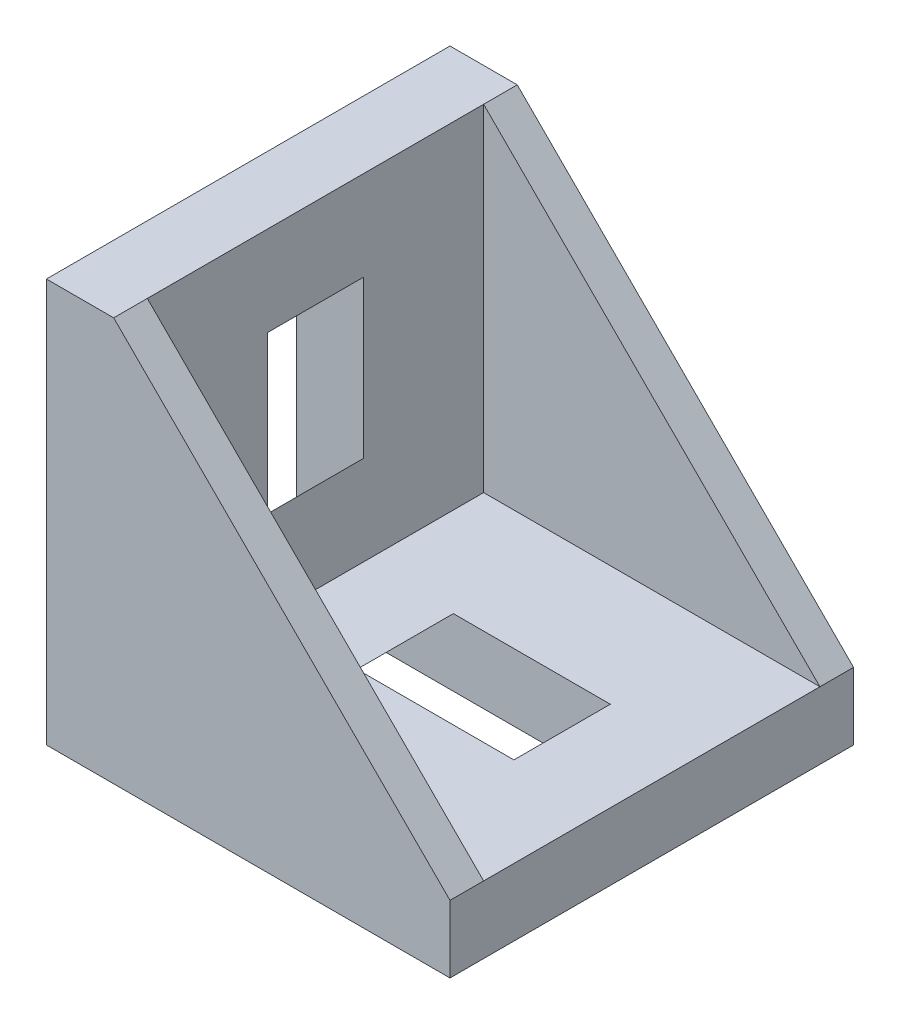
ISO-10303-21;
HEADER;
FILE_DESCRIPTION(('STEP AP214'),'2;1');
FILE_NAME('part.step','',(''),(''),'','','');
FILE_SCHEMA(('AUTOMOTIVE_DESIGN { 1 0 10303 214 1 1 1 1 }'));
ENDSEC;
DATA;
#1=APPLICATION_CONTEXT('core data for automotive mechanical design processes');
#2=APPLICATION_PROTOCOL_DEFINITION('international standard','automotive_design',2000,#1);
#3=PRODUCT_CONTEXT('',#1,'mechanical');
#4=PRODUCT('Part','Part','',(#3));
#5=PRODUCT_RELATED_PRODUCT_CATEGORY('part','',(#4));
#6=PRODUCT_DEFINITION_FORMATION('','',#4);
#7=PRODUCT_DEFINITION_CONTEXT('part definition',#1,'design');
#8=PRODUCT_DEFINITION('design','',#6,#7);
#9=PRODUCT_DEFINITION_SHAPE('','',#8);
#10=(LENGTH_UNIT() NAMED_UNIT(*) SI_UNIT(.MILLI.,.METRE.));
#11=(NAMED_UNIT(*) PLANE_ANGLE_UNIT() SI_UNIT($,.RADIAN.));
#12=(NAMED_UNIT(*) SI_UNIT($,.STERADIAN.) SOLID_ANGLE_UNIT());
#13=UNCERTAINTY_MEASURE_WITH_UNIT(LENGTH_MEASURE(1.E-05),#10,'distance_accuracy_value','');
#14=(GEOMETRIC_REPRESENTATION_CONTEXT(3) GLOBAL_UNCERTAINTY_ASSIGNED_CONTEXT((#13)) GLOBAL_UNIT_ASSIGNED_CONTEXT((#10,
#11,#12)) REPRESENTATION_CONTEXT('',''));
#15=CARTESIAN_POINT('',(0.,0.,0.));
#16=DIRECTION('',(0.,0.,1.));
#17=DIRECTION('',(1.,0.,0.));
#18=AXIS2_PLACEMENT_3D('',#15,#16,#17);
#19=CARTESIAN_POINT('',(0.,0.,9.));
#20=DIRECTION('',(1.,0.,0.));
#21=DIRECTION('',(0.,0.,-1.));
#22=AXIS2_PLACEMENT_3D('',#19,#20,#21);
#23=PLANE('',#22);
#24=DIRECTION('',(0.,0.,-1.));
#25=VECTOR('',#24,1.);
#26=CARTESIAN_POINT('',(0.,17.3,2.5));
#27=LINE('',#26,#25);
#28=CARTESIAN_POINT('',(0.,17.3,2.5));
#29=VERTEX_POINT('',#28);
#30=CARTESIAN_POINT('',(0.,17.3,-2.5));
#31=VERTEX_POINT('',#30);
#32=EDGE_CURVE('E52',#29,#31,#27,.T.);
#33=ORIENTED_EDGE('',*,*,#32,.F.);
#34=DIRECTION('',(0.,1.,0.));
#35=VECTOR('',#34,1.);
#36=CARTESIAN_POINT('',(0.,17.3,2.5));
#37=LINE('',#36,#35);
#38=CARTESIAN_POINT('',(0.,14.9992165715514,2.5));
#39=VERTEX_POINT('',#38);
#40=EDGE_CURVE('E56',#39,#29,#37,.T.);
#41=ORIENTED_EDGE('',*,*,#40,.F.);
#42=DIRECTION('',(0.,0.,-1.));
#43=VECTOR('',#42,1.);
#44=CARTESIAN_POINT('',(0.,14.9992165715514,2.5));
#45=LINE('',#44,#43);
#46=CARTESIAN_POINT('',(0.,14.9992165715514,-2.5));
#47=VERTEX_POINT('',#46);
#48=EDGE_CURVE('E222',#39,#47,#45,.T.);
#49=ORIENTED_EDGE('',*,*,#48,.T.);
#50=DIRECTION('',(0.,1.,0.));
#51=VECTOR('',#50,1.);
#52=CARTESIAN_POINT('',(0.,17.3,-2.5));
#53=LINE('',#52,#51);
#54=EDGE_CURVE('E212',#47,#31,#53,.T.);
#55=ORIENTED_EDGE('',*,*,#54,.T.);
#56=EDGE_LOOP('',(#33,#41,#49,#55));
#57=FACE_BOUND('',#56,.T.);
#58=DIRECTION('',(0.,-1.,0.));
#59=VECTOR('',#58,1.);
#60=CARTESIAN_POINT('',(0.,14.,-2.15));
#61=LINE('',#60,#59);
#62=CARTESIAN_POINT('',(0.,14.,-2.15));
#63=VERTEX_POINT('',#62);
#64=CARTESIAN_POINT('',(0.,4.,-2.15));
#65=VERTEX_POINT('',#64);
#66=EDGE_CURVE('E285',#63,#65,#61,.T.);
#67=ORIENTED_EDGE('',*,*,#66,.F.);
#68=DIRECTION('',(0.,0.,1.));
#69=VECTOR('',#68,1.);
#70=CARTESIAN_POINT('',(0.,14.,-2.15));
#71=LINE('',#70,#69);
#72=CARTESIAN_POINT('',(0.,14.,2.15));
#73=VERTEX_POINT('',#72);
#74=EDGE_CURVE('E308',#63,#73,#71,.T.);
#75=ORIENTED_EDGE('',*,*,#74,.T.);
#76=DIRECTION('',(0.,-1.,0.));
#77=VECTOR('',#76,1.);
#78=CARTESIAN_POINT('',(0.,14.,2.15));
#79=LINE('',#78,#77);
#80=CARTESIAN_POINT('',(0.,4.,2.15));
#81=VERTEX_POINT('',#80);
#82=EDGE_CURVE('E276',#73,#81,#79,.T.);
#83=ORIENTED_EDGE('',*,*,#82,.T.);
#84=DIRECTION('',(0.,0.,1.));
#85=VECTOR('',#84,1.);
#86=CARTESIAN_POINT('',(0.,4.,-2.15));
#87=LINE('',#86,#85);
#88=EDGE_CURVE('E297',#65,#81,#87,.T.);
#89=ORIENTED_EDGE('',*,*,#88,.F.);
#90=EDGE_LOOP('',(#67,#75,#83,#89));
#91=FACE_BOUND('',#90,.T.);
#92=DIRECTION('',(0.,-1.,0.));
#93=VECTOR('',#92,1.);
#94=CARTESIAN_POINT('',(0.,0.,-9.));
#95=LINE('',#94,#93);
#96=CARTESIAN_POINT('',(0.,18.,-9.));
#97=VERTEX_POINT('',#96);
#98=CARTESIAN_POINT('',(0.,0.,-9.));
#99=VERTEX_POINT('',#98);
#100=EDGE_CURVE('E348',#97,#99,#95,.T.);
#101=ORIENTED_EDGE('',*,*,#100,.T.);
#102=DIRECTION('',(0.,0.,-1.));
#103=VECTOR('',#102,1.);
#104=CARTESIAN_POINT('',(0.,0.,9.));
#105=LINE('',#104,#103);
#106=CARTESIAN_POINT('',(0.,0.,9.));
#107=VERTEX_POINT('',#106);
#108=EDGE_CURVE('E356',#107,#99,#105,.T.);
#109=ORIENTED_EDGE('',*,*,#108,.F.);
#110=DIRECTION('',(0.,-1.,0.));
#111=VECTOR('',#110,1.);
#112=CARTESIAN_POINT('',(0.,0.,9.));
#113=LINE('',#112,#111);
#114=CARTESIAN_POINT('',(0.,18.,9.));
#115=VERTEX_POINT('',#114);
#116=EDGE_CURVE('E354',#115,#107,#113,.T.);
#117=ORIENTED_EDGE('',*,*,#116,.F.);
#118=DIRECTION('',(0.,0.,-1.));
#119=VECTOR('',#118,1.);
#120=CARTESIAN_POINT('',(0.,18.,9.));
#121=LINE('',#120,#119);
#122=EDGE_CURVE('E370',#115,#97,#121,.T.);
#123=ORIENTED_EDGE('',*,*,#122,.T.);
#124=EDGE_LOOP('',(#101,#109,#117,#123));
#125=FACE_BOUND('',#124,.T.);
#126=DIRECTION('',(0.,1.,0.));
#127=VECTOR('',#126,1.);
#128=CARTESIAN_POINT('',(0.,1.23475047748417,2.5));
#129=LINE('',#128,#127);
#130=CARTESIAN_POINT('',(0.,1.23475047748417,2.5));
#131=VERTEX_POINT('',#130);
#132=CARTESIAN_POINT('',(0.,3.53553390593273,2.5));
#133=VERTEX_POINT('',#132);
#134=EDGE_CURVE('E226',#131,#133,#129,.T.);
#135=ORIENTED_EDGE('',*,*,#134,.F.);
#136=DIRECTION('',(0.,0.,-1.));
#137=VECTOR('',#136,1.);
#138=CARTESIAN_POINT('',(0.,1.23475047748417,2.5));
#139=LINE('',#138,#137);
#140=CARTESIAN_POINT('',(0.,1.23475047748417,-2.5));
#141=VERTEX_POINT('',#140);
#142=EDGE_CURVE('E235',#131,#141,#139,.T.);
#143=ORIENTED_EDGE('',*,*,#142,.T.);
#144=DIRECTION('',(0.,1.,0.));
#145=VECTOR('',#144,1.);
#146=CARTESIAN_POINT('',(0.,1.23475047748417,-2.5));
#147=LINE('',#146,#145);
#148=CARTESIAN_POINT('',(0.,3.53553390593273,-2.5));
#149=VERTEX_POINT('',#148);
#150=EDGE_CURVE('E217',#141,#149,#147,.T.);
#151=ORIENTED_EDGE('',*,*,#150,.T.);
#152=DIRECTION('',(0.,0.,-1.));
#153=VECTOR('',#152,1.);
#154=CARTESIAN_POINT('',(0.,3.53553390593273,2.5));
#155=LINE('',#154,#153);
#156=EDGE_CURVE('E249',#133,#149,#155,.T.);
#157=ORIENTED_EDGE('',*,*,#156,.F.);
#158=EDGE_LOOP('',(#135,#143,#151,#157));
#159=FACE_BOUND('',#158,.T.);
#160=ADVANCED_FACE('F37',(#57,#91,#125,#159),#23,.F.);
#161=CARTESIAN_POINT('',(18.,0.,9.));
#162=DIRECTION('',(0.,1.,0.));
#163=DIRECTION('',(-1.,0.,0.));
#164=AXIS2_PLACEMENT_3D('',#161,#162,#163);
#165=PLANE('',#164);
#166=DIRECTION('',(1.,0.,0.));
#167=VECTOR('',#166,1.);
#168=CARTESIAN_POINT('',(4.,0.,-2.15));
#169=LINE('',#168,#167);
#170=CARTESIAN_POINT('',(4.,0.,-2.15));
#171=VERTEX_POINT('',#170);
#172=CARTESIAN_POINT('',(14.,0.,-2.15));
#173=VERTEX_POINT('',#172);
#174=EDGE_CURVE('E255',#171,#173,#169,.T.);
#175=ORIENTED_EDGE('',*,*,#174,.F.);
#176=DIRECTION('',(0.,0.,1.));
#177=VECTOR('',#176,1.);
#178=CARTESIAN_POINT('',(4.,0.,-2.15));
#179=LINE('',#178,#177);
#180=CARTESIAN_POINT('',(4.,0.,2.15));
#181=VERTEX_POINT('',#180);
#182=EDGE_CURVE('E264',#171,#181,#179,.T.);
#183=ORIENTED_EDGE('',*,*,#182,.T.);
#184=DIRECTION('',(1.,0.,0.));
#185=VECTOR('',#184,1.);
#186=CARTESIAN_POINT('',(4.,0.,2.15));
#187=LINE('',#186,#185);
#188=CARTESIAN_POINT('',(14.,0.,2.15));
#189=VERTEX_POINT('',#188);
#190=EDGE_CURVE('E267',#181,#189,#187,.T.);
#191=ORIENTED_EDGE('',*,*,#190,.T.);
#192=DIRECTION('',(0.,0.,1.));
#193=VECTOR('',#192,1.);
#194=CARTESIAN_POINT('',(14.,0.,-2.15));
#195=LINE('',#194,#193);
#196=EDGE_CURVE('E280',#173,#189,#195,.T.);
#197=ORIENTED_EDGE('',*,*,#196,.F.);
#198=EDGE_LOOP('',(#175,#183,#191,#197));
#199=FACE_BOUND('',#198,.T.);
#200=DIRECTION('',(1.,0.,0.));
#201=VECTOR('',#200,1.);
#202=CARTESIAN_POINT('',(18.,0.,-9.));
#203=LINE('',#202,#201);
#204=CARTESIAN_POINT('',(18.,0.,-9.));
#205=VERTEX_POINT('',#204);
#206=EDGE_CURVE('E340',#99,#205,#203,.T.);
#207=ORIENTED_EDGE('',*,*,#206,.T.);
#208=DIRECTION('',(0.,0.,-1.));
#209=VECTOR('',#208,1.);
#210=CARTESIAN_POINT('',(18.,0.,9.));
#211=LINE('',#210,#209);
#212=CARTESIAN_POINT('',(18.,0.,9.));
#213=VERTEX_POINT('',#212);
#214=EDGE_CURVE('E11',#213,#205,#211,.T.);
#215=ORIENTED_EDGE('',*,*,#214,.F.);
#216=DIRECTION('',(1.,0.,0.));
#217=VECTOR('',#216,1.);
#218=CARTESIAN_POINT('',(18.,0.,9.));
#219=LINE('',#218,#217);
#220=EDGE_CURVE('E344',#107,#213,#219,.T.);
#221=ORIENTED_EDGE('',*,*,#220,.F.);
#222=ORIENTED_EDGE('',*,*,#108,.T.);
#223=EDGE_LOOP('',(#207,#215,#221,#222));
#224=FACE_BOUND('',#223,.T.);
#225=ADVANCED_FACE('F39',(#199,#224),#165,.F.);
#226=CARTESIAN_POINT('',(3.,3.,-7.5));
#227=DIRECTION('',(0.,-1.,0.));
#228=DIRECTION('',(0.,0.,-1.));
#229=AXIS2_PLACEMENT_3D('',#226,#227,#228);
#230=PLANE('',#229);
#231=DIRECTION('',(1.,0.,0.));
#232=VECTOR('',#231,1.);
#233=CARTESIAN_POINT('',(3.,3.,7.5));
#234=LINE('',#233,#232);
#235=CARTESIAN_POINT('',(3.,3.,7.5));
#236=VERTEX_POINT('',#235);
#237=CARTESIAN_POINT('',(18.,3.,7.5));
#238=VERTEX_POINT('',#237);
#239=EDGE_CURVE('E323',#236,#238,#234,.T.);
#240=ORIENTED_EDGE('',*,*,#239,.T.);
#241=DIRECTION('',(0.,0.,1.));
#242=VECTOR('',#241,1.);
#243=CARTESIAN_POINT('',(18.,3.,-7.5));
#244=LINE('',#243,#242);
#245=CARTESIAN_POINT('',(18.,3.,-7.5));
#246=VERTEX_POINT('',#245);
#247=EDGE_CURVE('E337',#246,#238,#244,.T.);
#248=ORIENTED_EDGE('',*,*,#247,.F.);
#249=DIRECTION('',(1.,0.,0.));
#250=VECTOR('',#249,1.);
#251=CARTESIAN_POINT('',(3.,3.,-7.5));
#252=LINE('',#251,#250);
#253=CARTESIAN_POINT('',(3.,3.,-7.5));
#254=VERTEX_POINT('',#253);
#255=EDGE_CURVE('E326',#254,#246,#252,.T.);
#256=ORIENTED_EDGE('',*,*,#255,.F.);
#257=DIRECTION('',(0.,0.,1.));
#258=VECTOR('',#257,1.);
#259=CARTESIAN_POINT('',(3.,3.,-7.5));
#260=LINE('',#259,#258);
#261=EDGE_CURVE('E341',#254,#236,#260,.T.);
#262=ORIENTED_EDGE('',*,*,#261,.T.);
#263=EDGE_LOOP('',(#240,#248,#256,#262));
#264=FACE_BOUND('',#263,.T.);
#265=DIRECTION('',(-1.,0.,0.));
#266=VECTOR('',#265,1.);
#267=CARTESIAN_POINT('',(7.,3.,-2.15));
#268=LINE('',#267,#266);
#269=CARTESIAN_POINT('',(14.,3.,-2.15));
#270=VERTEX_POINT('',#269);
#271=CARTESIAN_POINT('',(7.,3.,-2.15));
#272=VERTEX_POINT('',#271);
#273=EDGE_CURVE('E261',#270,#272,#268,.T.);
#274=ORIENTED_EDGE('',*,*,#273,.F.);
#275=DIRECTION('',(0.,0.,1.));
#276=VECTOR('',#275,1.);
#277=CARTESIAN_POINT('',(14.,3.,-2.15));
#278=LINE('',#277,#276);
#279=CARTESIAN_POINT('',(14.,3.,2.15));
#280=VERTEX_POINT('',#279);
#281=EDGE_CURVE('E277',#270,#280,#278,.T.);
#282=ORIENTED_EDGE('',*,*,#281,.T.);
#283=DIRECTION('',(-1.,0.,0.));
#284=VECTOR('',#283,1.);
#285=CARTESIAN_POINT('',(7.,3.,2.15));
#286=LINE('',#285,#284);
#287=CARTESIAN_POINT('',(7.,3.,2.15));
#288=VERTEX_POINT('',#287);
#289=EDGE_CURVE('E256',#280,#288,#286,.T.);
#290=ORIENTED_EDGE('',*,*,#289,.T.);
#291=DIRECTION('',(0.,0.,1.));
#292=VECTOR('',#291,1.);
#293=CARTESIAN_POINT('',(7.,3.,-2.15));
#294=LINE('',#293,#292);
#295=EDGE_CURVE('E273',#272,#288,#294,.T.);
#296=ORIENTED_EDGE('',*,*,#295,.F.);
#297=EDGE_LOOP('',(#274,#282,#290,#296));
#298=FACE_BOUND('',#297,.T.);
#299=ADVANCED_FACE('F414',(#264,#298),#230,.F.);
#300=CARTESIAN_POINT('',(3.,18.,-7.5));
#301=DIRECTION('',(-1.,0.,0.));
#302=DIRECTION('',(0.,-1.,0.));
#303=AXIS2_PLACEMENT_3D('',#300,#301,#302);
#304=PLANE('',#303);
#305=DIRECTION('',(0.,-1.,0.));
#306=VECTOR('',#305,1.);
#307=CARTESIAN_POINT('',(3.,18.,7.5));
#308=LINE('',#307,#306);
#309=CARTESIAN_POINT('',(3.,18.,7.5));
#310=VERTEX_POINT('',#309);
#311=EDGE_CURVE('E332',#310,#236,#308,.T.);
#312=ORIENTED_EDGE('',*,*,#311,.T.);
#313=ORIENTED_EDGE('',*,*,#261,.F.);
#314=DIRECTION('',(0.,-1.,0.));
#315=VECTOR('',#314,1.);
#316=CARTESIAN_POINT('',(3.,18.,-7.5));
#317=LINE('',#316,#315);
#318=CARTESIAN_POINT('',(3.,18.,-7.5));
#319=VERTEX_POINT('',#318);
#320=EDGE_CURVE('E322',#319,#254,#317,.T.);
#321=ORIENTED_EDGE('',*,*,#320,.F.);
#322=DIRECTION('',(0.,0.,1.));
#323=VECTOR('',#322,1.);
#324=CARTESIAN_POINT('',(3.,18.,-7.5));
#325=LINE('',#324,#323);
#326=EDGE_CURVE('E329',#319,#310,#325,.T.);
#327=ORIENTED_EDGE('',*,*,#326,.T.);
#328=EDGE_LOOP('',(#312,#313,#321,#327));
#329=FACE_BOUND('',#328,.T.);
#330=DIRECTION('',(0.,1.,0.));
#331=VECTOR('',#330,1.);
#332=CARTESIAN_POINT('',(3.,14.,-2.15));
#333=LINE('',#332,#331);
#334=CARTESIAN_POINT('',(3.,7.,-2.15));
#335=VERTEX_POINT('',#334);
#336=CARTESIAN_POINT('',(3.,14.,-2.15));
#337=VERTEX_POINT('',#336);
#338=EDGE_CURVE('E292',#335,#337,#333,.T.);
#339=ORIENTED_EDGE('',*,*,#338,.F.);
#340=DIRECTION('',(0.,0.,1.));
#341=VECTOR('',#340,1.);
#342=CARTESIAN_POINT('',(3.,7.,-2.15));
#343=LINE('',#342,#341);
#344=CARTESIAN_POINT('',(3.,7.,2.15));
#345=VERTEX_POINT('',#344);
#346=EDGE_CURVE('E315',#335,#345,#343,.T.);
#347=ORIENTED_EDGE('',*,*,#346,.T.);
#348=DIRECTION('',(0.,1.,0.));
#349=VECTOR('',#348,1.);
#350=CARTESIAN_POINT('',(3.,14.,2.15));
#351=LINE('',#350,#349);
#352=CARTESIAN_POINT('',(3.,14.,2.15));
#353=VERTEX_POINT('',#352);
#354=EDGE_CURVE('E303',#345,#353,#351,.T.);
#355=ORIENTED_EDGE('',*,*,#354,.T.);
#356=DIRECTION('',(0.,0.,1.));
#357=VECTOR('',#356,1.);
#358=CARTESIAN_POINT('',(3.,14.,-2.15));
#359=LINE('',#358,#357);
#360=EDGE_CURVE('E312',#337,#353,#359,.T.);
#361=ORIENTED_EDGE('',*,*,#360,.F.);
#362=EDGE_LOOP('',(#339,#347,#355,#361));
#363=FACE_BOUND('',#362,.T.);
#364=ADVANCED_FACE('F419',(#329,#363),#304,.F.);
#365=CARTESIAN_POINT('',(18.,3.,9.));
#366=DIRECTION('',(-0.707106781186547,-0.707106781186547,0.));
#367=DIRECTION('',(0.707106781186548,-0.707106781186548,0.));
#368=AXIS2_PLACEMENT_3D('',#365,#366,#367);
#369=PLANE('',#368);
#370=DIRECTION('',(-0.707106781186547,0.707106781186547,0.));
#371=VECTOR('',#370,1.);
#372=CARTESIAN_POINT('',(3.,18.,-7.5));
#373=LINE('',#372,#371);
#374=EDGE_CURVE('E320',#246,#319,#373,.T.);
#375=ORIENTED_EDGE('',*,*,#374,.F.);
#376=DIRECTION('',(0.,0.,-1.));
#377=VECTOR('',#376,1.);
#378=CARTESIAN_POINT('',(18.,3.,9.));
#379=LINE('',#378,#377);
#380=CARTESIAN_POINT('',(18.,3.,-9.));
#381=VERTEX_POINT('',#380);
#382=EDGE_CURVE('E376',#246,#381,#379,.T.);
#383=ORIENTED_EDGE('',*,*,#382,.T.);
#384=DIRECTION('',(-0.707106781186547,0.707106781186547,0.));
#385=VECTOR('',#384,1.);
#386=CARTESIAN_POINT('',(18.,3.,-9.));
#387=LINE('',#386,#385);
#388=CARTESIAN_POINT('',(3.,18.,-9.));
#389=VERTEX_POINT('',#388);
#390=EDGE_CURVE('E362',#381,#389,#387,.T.);
#391=ORIENTED_EDGE('',*,*,#390,.T.);
#392=DIRECTION('',(0.,0.,-1.));
#393=VECTOR('',#392,1.);
#394=CARTESIAN_POINT('',(3.,18.,9.));
#395=LINE('',#394,#393);
#396=EDGE_CURVE('E373',#319,#389,#395,.T.);
#397=ORIENTED_EDGE('',*,*,#396,.F.);
#398=EDGE_LOOP('',(#375,#383,#391,#397));
#399=FACE_BOUND('',#398,.T.);
#400=ADVANCED_FACE('F384',(#399),#369,.F.);
#401=CARTESIAN_POINT('',(18.,3.,9.));
#402=DIRECTION('',(-1.,0.,0.));
#403=DIRECTION('',(0.,0.,1.));
#404=AXIS2_PLACEMENT_3D('',#401,#402,#403);
#405=PLANE('',#404);
#406=DIRECTION('',(0.,1.,0.));
#407=VECTOR('',#406,1.);
#408=CARTESIAN_POINT('',(18.,3.,-9.));
#409=LINE('',#408,#407);
#410=EDGE_CURVE('E359',#205,#381,#409,.T.);
#411=ORIENTED_EDGE('',*,*,#410,.T.);
#412=ORIENTED_EDGE('',*,*,#382,.F.);
#413=ORIENTED_EDGE('',*,*,#247,.T.);
#414=CARTESIAN_POINT('',(18.,3.,9.));
#415=VERTEX_POINT('',#414);
#416=EDGE_CURVE('E45',#415,#238,#379,.T.);
#417=ORIENTED_EDGE('',*,*,#416,.F.);
#418=DIRECTION('',(0.,1.,0.));
#419=VECTOR('',#418,1.);
#420=CARTESIAN_POINT('',(18.,3.,9.));
#421=LINE('',#420,#419);
#422=EDGE_CURVE('E347',#213,#415,#421,.T.);
#423=ORIENTED_EDGE('',*,*,#422,.F.);
#424=ORIENTED_EDGE('',*,*,#214,.T.);
#425=EDGE_LOOP('',(#411,#412,#413,#417,#423,#424));
#426=FACE_BOUND('',#425,.T.);
#427=ADVANCED_FACE('F389',(#426),#405,.F.);
#428=ORIENTED_EDGE('',*,*,#416,.T.);
#429=DIRECTION('',(-0.707106781186547,0.707106781186547,0.));
#430=VECTOR('',#429,1.);
#431=CARTESIAN_POINT('',(3.,18.,7.5));
#432=LINE('',#431,#430);
#433=EDGE_CURVE('E311',#238,#310,#432,.T.);
#434=ORIENTED_EDGE('',*,*,#433,.T.);
#435=CARTESIAN_POINT('',(3.,18.,9.));
#436=VERTEX_POINT('',#435);
#437=EDGE_CURVE('E374',#436,#310,#395,.T.);
#438=ORIENTED_EDGE('',*,*,#437,.F.);
#439=DIRECTION('',(-0.707106781186547,0.707106781186547,0.));
#440=VECTOR('',#439,1.);
#441=CARTESIAN_POINT('',(18.,3.,9.));
#442=LINE('',#441,#440);
#443=EDGE_CURVE('E350',#415,#436,#442,.T.);
#444=ORIENTED_EDGE('',*,*,#443,.F.);
#445=EDGE_LOOP('',(#428,#434,#438,#444));
#446=FACE_BOUND('',#445,.T.);
#447=ADVANCED_FACE('F408',(#446),#369,.F.);
#448=CARTESIAN_POINT('',(3.,18.,9.));
#449=DIRECTION('',(0.,-1.,0.));
#450=DIRECTION('',(0.,0.,-1.));
#451=AXIS2_PLACEMENT_3D('',#448,#449,#450);
#452=PLANE('',#451);
#453=DIRECTION('',(-1.,0.,0.));
#454=VECTOR('',#453,1.);
#455=CARTESIAN_POINT('',(3.,18.,-9.));
#456=LINE('',#455,#454);
#457=EDGE_CURVE('E365',#389,#97,#456,.T.);
#458=ORIENTED_EDGE('',*,*,#457,.T.);
#459=ORIENTED_EDGE('',*,*,#122,.F.);
#460=DIRECTION('',(-1.,0.,0.));
#461=VECTOR('',#460,1.);
#462=CARTESIAN_POINT('',(3.,18.,9.));
#463=LINE('',#462,#461);
#464=EDGE_CURVE('E352',#436,#115,#463,.T.);
#465=ORIENTED_EDGE('',*,*,#464,.F.);
#466=ORIENTED_EDGE('',*,*,#437,.T.);
#467=ORIENTED_EDGE('',*,*,#326,.F.);
#468=ORIENTED_EDGE('',*,*,#396,.T.);
#469=EDGE_LOOP('',(#458,#459,#465,#466,#467,#468));
#470=FACE_BOUND('',#469,.T.);
#471=ADVANCED_FACE('F397',(#470),#452,.F.);
#472=CARTESIAN_POINT('',(0.,0.,9.));
#473=DIRECTION('',(0.,0.,-1.));
#474=DIRECTION('',(-1.,0.,0.));
#475=AXIS2_PLACEMENT_3D('',#472,#473,#474);
#476=PLANE('',#475);
#477=ORIENTED_EDGE('',*,*,#220,.T.);
#478=ORIENTED_EDGE('',*,*,#422,.T.);
#479=ORIENTED_EDGE('',*,*,#443,.T.);
#480=ORIENTED_EDGE('',*,*,#464,.T.);
#481=ORIENTED_EDGE('',*,*,#116,.T.);
#482=EDGE_LOOP('',(#477,#478,#479,#480,#481));
#483=FACE_BOUND('',#482,.T.);
#484=ADVANCED_FACE('F406',(#483),#476,.F.);
#485=CARTESIAN_POINT('',(0.,0.,-9.));
#486=DIRECTION('',(0.,0.,-1.));
#487=DIRECTION('',(-1.,0.,0.));
#488=AXIS2_PLACEMENT_3D('',#485,#486,#487);
#489=PLANE('',#488);
#490=ORIENTED_EDGE('',*,*,#206,.F.);
#491=ORIENTED_EDGE('',*,*,#100,.F.);
#492=ORIENTED_EDGE('',*,*,#457,.F.);
#493=ORIENTED_EDGE('',*,*,#390,.F.);
#494=ORIENTED_EDGE('',*,*,#410,.F.);
#495=EDGE_LOOP('',(#490,#491,#492,#493,#494));
#496=FACE_BOUND('',#495,.T.);
#497=ADVANCED_FACE('F393',(#496),#489,.T.);
#498=CARTESIAN_POINT('',(18.,3.,-7.5));
#499=DIRECTION('',(0.,0.,1.));
#500=DIRECTION('',(1.,0.,0.));
#501=AXIS2_PLACEMENT_3D('',#498,#499,#500);
#502=PLANE('',#501);
#503=ORIENTED_EDGE('',*,*,#374,.T.);
#504=ORIENTED_EDGE('',*,*,#320,.T.);
#505=ORIENTED_EDGE('',*,*,#255,.T.);
#506=EDGE_LOOP('',(#503,#504,#505));
#507=FACE_BOUND('',#506,.T.);
#508=ADVANCED_FACE('F422',(#507),#502,.T.);
#509=CARTESIAN_POINT('',(18.,3.,7.5));
#510=DIRECTION('',(0.,0.,1.));
#511=DIRECTION('',(1.,0.,0.));
#512=AXIS2_PLACEMENT_3D('',#509,#510,#511);
#513=PLANE('',#512);
#514=ORIENTED_EDGE('',*,*,#433,.F.);
#515=ORIENTED_EDGE('',*,*,#239,.F.);
#516=ORIENTED_EDGE('',*,*,#311,.F.);
#517=EDGE_LOOP('',(#514,#515,#516));
#518=FACE_BOUND('',#517,.T.);
#519=ADVANCED_FACE('F412',(#518),#513,.F.);
#520=CARTESIAN_POINT('',(0.,14.,-2.15));
#521=DIRECTION('',(0.,1.,0.));
#522=DIRECTION('',(0.,0.,1.));
#523=AXIS2_PLACEMENT_3D('',#520,#521,#522);
#524=PLANE('',#523);
#525=DIRECTION('',(-1.,0.,0.));
#526=VECTOR('',#525,1.);
#527=CARTESIAN_POINT('',(0.,14.,2.15));
#528=LINE('',#527,#526);
#529=EDGE_CURVE('E289',#353,#73,#528,.T.);
#530=ORIENTED_EDGE('',*,*,#529,.T.);
#531=ORIENTED_EDGE('',*,*,#74,.F.);
#532=DIRECTION('',(-1.,0.,0.));
#533=VECTOR('',#532,1.);
#534=CARTESIAN_POINT('',(0.,14.,-2.15));
#535=LINE('',#534,#533);
#536=EDGE_CURVE('E294',#337,#63,#535,.T.);
#537=ORIENTED_EDGE('',*,*,#536,.F.);
#538=ORIENTED_EDGE('',*,*,#360,.T.);
#539=EDGE_LOOP('',(#530,#531,#537,#538));
#540=FACE_BOUND('',#539,.T.);
#541=ADVANCED_FACE('F429',(#540),#524,.F.);
#542=CARTESIAN_POINT('',(0.,4.,-2.15));
#543=DIRECTION('',(0.707106781186548,-0.707106781186547,0.));
#544=DIRECTION('',(0.707106781186547,0.707106781186548,0.));
#545=AXIS2_PLACEMENT_3D('',#542,#543,#544);
#546=PLANE('',#545);
#547=DIRECTION('',(0.707106781186547,0.707106781186548,0.));
#548=VECTOR('',#547,1.);
#549=CARTESIAN_POINT('',(0.,4.,2.15));
#550=LINE('',#549,#548);
#551=EDGE_CURVE('E300',#81,#345,#550,.T.);
#552=ORIENTED_EDGE('',*,*,#551,.T.);
#553=ORIENTED_EDGE('',*,*,#346,.F.);
#554=DIRECTION('',(0.707106781186547,0.707106781186548,0.));
#555=VECTOR('',#554,1.);
#556=CARTESIAN_POINT('',(0.,4.,-2.15));
#557=LINE('',#556,#555);
#558=EDGE_CURVE('E288',#65,#335,#557,.T.);
#559=ORIENTED_EDGE('',*,*,#558,.F.);
#560=ORIENTED_EDGE('',*,*,#88,.T.);
#561=EDGE_LOOP('',(#552,#553,#559,#560));
#562=FACE_BOUND('',#561,.T.);
#563=ADVANCED_FACE('F513',(#562),#546,.F.);
#564=CARTESIAN_POINT('',(0.,14.,-2.15));
#565=DIRECTION('',(0.,0.,1.));
#566=DIRECTION('',(1.,0.,0.));
#567=AXIS2_PLACEMENT_3D('',#564,#565,#566);
#568=PLANE('',#567);
#569=ORIENTED_EDGE('',*,*,#66,.T.);
#570=ORIENTED_EDGE('',*,*,#558,.T.);
#571=ORIENTED_EDGE('',*,*,#338,.T.);
#572=ORIENTED_EDGE('',*,*,#536,.T.);
#573=EDGE_LOOP('',(#569,#570,#571,#572));
#574=FACE_BOUND('',#573,.T.);
#575=ADVANCED_FACE('F523',(#574),#568,.T.);
#576=CARTESIAN_POINT('',(0.,14.,2.15));
#577=DIRECTION('',(0.,0.,1.));
#578=DIRECTION('',(1.,0.,0.));
#579=AXIS2_PLACEMENT_3D('',#576,#577,#578);
#580=PLANE('',#579);
#581=ORIENTED_EDGE('',*,*,#82,.F.);
#582=ORIENTED_EDGE('',*,*,#529,.F.);
#583=ORIENTED_EDGE('',*,*,#354,.F.);
#584=ORIENTED_EDGE('',*,*,#551,.F.);
#585=EDGE_LOOP('',(#581,#582,#583,#584));
#586=FACE_BOUND('',#585,.T.);
#587=ADVANCED_FACE('F532',(#586),#580,.F.);
#588=CARTESIAN_POINT('',(7.,3.,-2.15));
#589=DIRECTION('',(-0.707106781186548,0.707106781186547,0.));
#590=DIRECTION('',(-0.707106781186547,-0.707106781186548,0.));
#591=AXIS2_PLACEMENT_3D('',#588,#589,#590);
#592=PLANE('',#591);
#593=DIRECTION('',(-0.707106781186547,-0.707106781186548,0.));
#594=VECTOR('',#593,1.);
#595=CARTESIAN_POINT('',(7.,3.,2.15));
#596=LINE('',#595,#594);
#597=EDGE_CURVE('E251',#288,#181,#596,.T.);
#598=ORIENTED_EDGE('',*,*,#597,.T.);
#599=ORIENTED_EDGE('',*,*,#182,.F.);
#600=DIRECTION('',(-0.707106781186547,-0.707106781186548,0.));
#601=VECTOR('',#600,1.);
#602=CARTESIAN_POINT('',(7.,3.,-2.15));
#603=LINE('',#602,#601);
#604=EDGE_CURVE('E252',#272,#171,#603,.T.);
#605=ORIENTED_EDGE('',*,*,#604,.F.);
#606=ORIENTED_EDGE('',*,*,#295,.T.);
#607=EDGE_LOOP('',(#598,#599,#605,#606));
#608=FACE_BOUND('',#607,.T.);
#609=ADVANCED_FACE('F542',(#608),#592,.F.);
#610=CARTESIAN_POINT('',(14.,3.,-2.15));
#611=DIRECTION('',(1.,0.,0.));
#612=DIRECTION('',(0.,0.,-1.));
#613=AXIS2_PLACEMENT_3D('',#610,#611,#612);
#614=PLANE('',#613);
#615=DIRECTION('',(0.,1.,0.));
#616=VECTOR('',#615,1.);
#617=CARTESIAN_POINT('',(14.,3.,2.15));
#618=LINE('',#617,#616);
#619=EDGE_CURVE('E269',#189,#280,#618,.T.);
#620=ORIENTED_EDGE('',*,*,#619,.T.);
#621=ORIENTED_EDGE('',*,*,#281,.F.);
#622=DIRECTION('',(0.,1.,0.));
#623=VECTOR('',#622,1.);
#624=CARTESIAN_POINT('',(14.,3.,-2.15));
#625=LINE('',#624,#623);
#626=EDGE_CURVE('E258',#173,#270,#625,.T.);
#627=ORIENTED_EDGE('',*,*,#626,.F.);
#628=ORIENTED_EDGE('',*,*,#196,.T.);
#629=EDGE_LOOP('',(#620,#621,#627,#628));
#630=FACE_BOUND('',#629,.T.);
#631=ADVANCED_FACE('F552',(#630),#614,.F.);
#632=CARTESIAN_POINT('',(4.,0.,-2.15));
#633=DIRECTION('',(0.,0.,1.));
#634=DIRECTION('',(1.,0.,0.));
#635=AXIS2_PLACEMENT_3D('',#632,#633,#634);
#636=PLANE('',#635);
#637=ORIENTED_EDGE('',*,*,#604,.T.);
#638=ORIENTED_EDGE('',*,*,#174,.T.);
#639=ORIENTED_EDGE('',*,*,#626,.T.);
#640=ORIENTED_EDGE('',*,*,#273,.T.);
#641=EDGE_LOOP('',(#637,#638,#639,#640));
#642=FACE_BOUND('',#641,.T.);
#643=ADVANCED_FACE('F561',(#642),#636,.T.);
#644=CARTESIAN_POINT('',(4.,0.,2.15));
#645=DIRECTION('',(0.,0.,1.));
#646=DIRECTION('',(1.,0.,0.));
#647=AXIS2_PLACEMENT_3D('',#644,#645,#646);
#648=PLANE('',#647);
#649=ORIENTED_EDGE('',*,*,#597,.F.);
#650=ORIENTED_EDGE('',*,*,#289,.F.);
#651=ORIENTED_EDGE('',*,*,#619,.F.);
#652=ORIENTED_EDGE('',*,*,#190,.F.);
#653=EDGE_LOOP('',(#649,#650,#651,#652));
#654=FACE_BOUND('',#653,.T.);
#655=ADVANCED_FACE('F581',(#654),#648,.F.);
#656=CARTESIAN_POINT('',(0.,3.53553390593273,2.5));
#657=DIRECTION('',(0.748377652692093,-0.663272861612077,0.));
#658=DIRECTION('',(0.663272861612077,0.748377652692093,0.));
#659=AXIS2_PLACEMENT_3D('',#656,#657,#658);
#660=PLANE('',#659);
#661=DIRECTION('',(-0.663272861612077,-0.748377652692093,0.));
#662=VECTOR('',#661,1.);
#663=CARTESIAN_POINT('',(0.,3.53553390593273,-2.5));
#664=LINE('',#663,#662);
#665=CARTESIAN_POINT('',(-1.8,1.50457522691833,-2.5));
#666=VERTEX_POINT('',#665);
#667=EDGE_CURVE('E220',#149,#666,#664,.T.);
#668=ORIENTED_EDGE('',*,*,#667,.T.);
#669=DIRECTION('',(0.,0.,-1.));
#670=VECTOR('',#669,1.);
#671=CARTESIAN_POINT('',(-1.8,1.50457522691833,2.5));
#672=LINE('',#671,#670);
#673=CARTESIAN_POINT('',(-1.8,1.50457522691833,2.5));
#674=VERTEX_POINT('',#673);
#675=EDGE_CURVE('E246',#674,#666,#672,.T.);
#676=ORIENTED_EDGE('',*,*,#675,.F.);
#677=DIRECTION('',(-0.663272861612077,-0.748377652692093,0.));
#678=VECTOR('',#677,1.);
#679=CARTESIAN_POINT('',(0.,3.53553390593273,2.5));
#680=LINE('',#679,#678);
#681=EDGE_CURVE('E229',#133,#674,#680,.T.);
#682=ORIENTED_EDGE('',*,*,#681,.F.);
#683=ORIENTED_EDGE('',*,*,#156,.T.);
#684=EDGE_LOOP('',(#668,#676,#682,#683));
#685=FACE_BOUND('',#684,.T.);
#686=ADVANCED_FACE('F576',(#685),#660,.F.);
#687=CARTESIAN_POINT('',(-1.8,1.50457522691833,2.5));
#688=DIRECTION('',(0.701530929291496,0.71263900766616,0.));
#689=DIRECTION('',(-0.71263900766616,0.701530929291496,0.));
#690=AXIS2_PLACEMENT_3D('',#687,#688,#689);
#691=PLANE('',#690);
#692=DIRECTION('',(0.71263900766616,-0.701530929291496,0.));
#693=VECTOR('',#692,1.);
#694=CARTESIAN_POINT('',(-1.8,1.50457522691833,-2.5));
#695=LINE('',#694,#693);
#696=CARTESIAN_POINT('',(-0.790946088307916,0.511249685150936,-2.5));
#697=VERTEX_POINT('',#696);
#698=EDGE_CURVE('E238',#666,#697,#695,.T.);
#699=ORIENTED_EDGE('',*,*,#698,.T.);
#700=DIRECTION('',(0.,0.,-1.));
#701=VECTOR('',#700,1.);
#702=CARTESIAN_POINT('',(-0.790946088307916,0.511249685150936,2.5));
#703=LINE('',#702,#701);
#704=CARTESIAN_POINT('',(-0.790946088307916,0.511249685150936,2.5));
#705=VERTEX_POINT('',#704);
#706=EDGE_CURVE('E243',#705,#697,#703,.T.);
#707=ORIENTED_EDGE('',*,*,#706,.F.);
#708=DIRECTION('',(0.71263900766616,-0.701530929291496,0.));
#709=VECTOR('',#708,1.);
#710=CARTESIAN_POINT('',(-1.8,1.50457522691833,2.5));
#711=LINE('',#710,#709);
#712=EDGE_CURVE('E232',#674,#705,#711,.T.);
#713=ORIENTED_EDGE('',*,*,#712,.F.);
#714=ORIENTED_EDGE('',*,*,#675,.T.);
#715=EDGE_LOOP('',(#699,#707,#713,#714));
#716=FACE_BOUND('',#715,.T.);
#717=ADVANCED_FACE('F580',(#716),#691,.F.);
#718=CARTESIAN_POINT('',(-0.790946088307916,0.511249685150936,2.5));
#719=DIRECTION('',(-0.674947068655146,0.737866149456543,0.));
#720=DIRECTION('',(-0.737866149456543,-0.674947068655146,0.));
#721=AXIS2_PLACEMENT_3D('',#718,#719,#720);
#722=PLANE('',#721);
#723=DIRECTION('',(0.737866149456543,0.674947068655146,0.));
#724=VECTOR('',#723,1.);
#725=CARTESIAN_POINT('',(-0.790946088307916,0.511249685150936,-2.5));
#726=LINE('',#725,#724);
#727=EDGE_CURVE('E230',#697,#141,#726,.T.);
#728=ORIENTED_EDGE('',*,*,#727,.T.);
#729=ORIENTED_EDGE('',*,*,#142,.F.);
#730=DIRECTION('',(0.737866149456543,0.674947068655146,0.));
#731=VECTOR('',#730,1.);
#732=CARTESIAN_POINT('',(-0.790946088307916,0.511249685150936,2.5));
#733=LINE('',#732,#731);
#734=EDGE_CURVE('E234',#705,#131,#733,.T.);
#735=ORIENTED_EDGE('',*,*,#734,.F.);
#736=ORIENTED_EDGE('',*,*,#706,.T.);
#737=EDGE_LOOP('',(#728,#729,#735,#736));
#738=FACE_BOUND('',#737,.T.);
#739=ADVANCED_FACE('F593',(#738),#722,.F.);
#740=CARTESIAN_POINT('',(0.,1.23475047748417,2.5));
#741=DIRECTION('',(0.,0.,-1.));
#742=DIRECTION('',(-1.,0.,0.));
#743=AXIS2_PLACEMENT_3D('',#740,#741,#742);
#744=PLANE('',#743);
#745=ORIENTED_EDGE('',*,*,#134,.T.);
#746=ORIENTED_EDGE('',*,*,#681,.T.);
#747=ORIENTED_EDGE('',*,*,#712,.T.);
#748=ORIENTED_EDGE('',*,*,#734,.T.);
#749=EDGE_LOOP('',(#745,#746,#747,#748));
#750=FACE_BOUND('',#749,.T.);
#751=ADVANCED_FACE('F604',(#750),#744,.F.);
#752=CARTESIAN_POINT('',(0.,1.23475047748417,-2.5));
#753=DIRECTION('',(0.,0.,-1.));
#754=DIRECTION('',(-1.,0.,0.));
#755=AXIS2_PLACEMENT_3D('',#752,#753,#754);
#756=PLANE('',#755);
#757=ORIENTED_EDGE('',*,*,#150,.F.);
#758=ORIENTED_EDGE('',*,*,#727,.F.);
#759=ORIENTED_EDGE('',*,*,#698,.F.);
#760=ORIENTED_EDGE('',*,*,#667,.F.);
#761=EDGE_LOOP('',(#757,#758,#759,#760));
#762=FACE_BOUND('',#761,.T.);
#763=ADVANCED_FACE('F615',(#762),#756,.T.);
#764=CARTESIAN_POINT('',(-1.8,15.2690413209856,2.5));
#765=DIRECTION('',(0.748377652692095,-0.663272861612075,0.));
#766=DIRECTION('',(0.663272861612075,0.748377652692095,0.));
#767=AXIS2_PLACEMENT_3D('',#764,#765,#766);
#768=PLANE('',#767);
#769=DIRECTION('',(-0.663272861612075,-0.748377652692095,0.));
#770=VECTOR('',#769,1.);
#771=CARTESIAN_POINT('',(-1.8,15.2690413209856,-2.5));
#772=LINE('',#771,#770);
#773=CARTESIAN_POINT('',(-1.8,15.2690413209856,-2.5));
#774=VERTEX_POINT('',#773);
#775=EDGE_CURVE('E216',#31,#774,#772,.T.);
#776=ORIENTED_EDGE('',*,*,#775,.T.);
#777=DIRECTION('',(0.,0.,-1.));
#778=VECTOR('',#777,1.);
#779=CARTESIAN_POINT('',(-1.8,15.2690413209856,2.5));
#780=LINE('',#779,#778);
#781=CARTESIAN_POINT('',(-1.8,15.2690413209856,2.5));
#782=VERTEX_POINT('',#781);
#783=EDGE_CURVE('E200',#782,#774,#780,.T.);
#784=ORIENTED_EDGE('',*,*,#783,.F.);
#785=DIRECTION('',(-0.663272861612075,-0.748377652692095,0.));
#786=VECTOR('',#785,1.);
#787=CARTESIAN_POINT('',(-1.8,15.2690413209856,2.5));
#788=LINE('',#787,#786);
#789=EDGE_CURVE('E207',#29,#782,#788,.T.);
#790=ORIENTED_EDGE('',*,*,#789,.F.);
#791=ORIENTED_EDGE('',*,*,#32,.T.);
#792=EDGE_LOOP('',(#776,#784,#790,#791));
#793=FACE_BOUND('',#792,.T.);
#794=ADVANCED_FACE('F214',(#793),#768,.F.);
#795=CARTESIAN_POINT('',(-0.790946088307929,14.2757157792182,2.5));
#796=DIRECTION('',(0.701530929291497,0.71263900766616,0.));
#797=DIRECTION('',(-0.71263900766616,0.701530929291497,0.));
#798=AXIS2_PLACEMENT_3D('',#795,#796,#797);
#799=PLANE('',#798);
#800=DIRECTION('',(0.71263900766616,-0.701530929291497,0.));
#801=VECTOR('',#800,1.);
#802=CARTESIAN_POINT('',(-0.790946088307929,14.2757157792182,-2.5));
#803=LINE('',#802,#801);
#804=CARTESIAN_POINT('',(-0.790946088307929,14.2757157792182,-2.5));
#805=VERTEX_POINT('',#804);
#806=EDGE_CURVE('E725',#774,#805,#803,.T.);
#807=ORIENTED_EDGE('',*,*,#806,.T.);
#808=DIRECTION('',(0.,0.,-1.));
#809=VECTOR('',#808,1.);
#810=CARTESIAN_POINT('',(-0.790946088307929,14.2757157792182,2.5));
#811=LINE('',#810,#809);
#812=CARTESIAN_POINT('',(-0.790946088307929,14.2757157792182,2.5));
#813=VERTEX_POINT('',#812);
#814=EDGE_CURVE('E203',#813,#805,#811,.T.);
#815=ORIENTED_EDGE('',*,*,#814,.F.);
#816=DIRECTION('',(0.71263900766616,-0.701530929291497,0.));
#817=VECTOR('',#816,1.);
#818=CARTESIAN_POINT('',(-0.790946088307929,14.2757157792182,2.5));
#819=LINE('',#818,#817);
#820=EDGE_CURVE('E196',#782,#813,#819,.T.);
#821=ORIENTED_EDGE('',*,*,#820,.F.);
#822=ORIENTED_EDGE('',*,*,#783,.T.);
#823=EDGE_LOOP('',(#807,#815,#821,#822));
#824=FACE_BOUND('',#823,.T.);
#825=ADVANCED_FACE('F198',(#824),#799,.F.);
#826=CARTESIAN_POINT('',(0.,14.9992165715514,2.5));
#827=DIRECTION('',(-0.674947068655143,0.737866149456546,0.));
#828=DIRECTION('',(-0.737866149456546,-0.674947068655143,0.));
#829=AXIS2_PLACEMENT_3D('',#826,#827,#828);
#830=PLANE('',#829);
#831=DIRECTION('',(0.737866149456546,0.674947068655143,0.));
#832=VECTOR('',#831,1.);
#833=CARTESIAN_POINT('',(0.,14.9992165715514,-2.5));
#834=LINE('',#833,#832);
#835=EDGE_CURVE('E727',#805,#47,#834,.T.);
#836=ORIENTED_EDGE('',*,*,#835,.T.);
#837=ORIENTED_EDGE('',*,*,#48,.F.);
#838=DIRECTION('',(0.737866149456546,0.674947068655143,0.));
#839=VECTOR('',#838,1.);
#840=CARTESIAN_POINT('',(0.,14.9992165715514,2.5));
#841=LINE('',#840,#839);
#842=EDGE_CURVE('E206',#813,#39,#841,.T.);
#843=ORIENTED_EDGE('',*,*,#842,.F.);
#844=ORIENTED_EDGE('',*,*,#814,.T.);
#845=EDGE_LOOP('',(#836,#837,#843,#844));
#846=FACE_BOUND('',#845,.T.);
#847=ADVANCED_FACE('F645',(#846),#830,.F.);
#848=CARTESIAN_POINT('',(-1.8,15.2690413209856,2.5));
#849=DIRECTION('',(0.,0.,1.));
#850=DIRECTION('',(1.,0.,0.));
#851=AXIS2_PLACEMENT_3D('',#848,#849,#850);
#852=PLANE('',#851);
#853=ORIENTED_EDGE('',*,*,#789,.T.);
#854=ORIENTED_EDGE('',*,*,#820,.T.);
#855=ORIENTED_EDGE('',*,*,#842,.T.);
#856=ORIENTED_EDGE('',*,*,#40,.T.);
#857=EDGE_LOOP('',(#853,#854,#855,#856));
#858=FACE_BOUND('',#857,.T.);
#859=ADVANCED_FACE('F210',(#858),#852,.T.);
#860=CARTESIAN_POINT('',(-1.8,15.2690413209856,-2.5));
#861=DIRECTION('',(0.,0.,1.));
#862=DIRECTION('',(1.,0.,0.));
#863=AXIS2_PLACEMENT_3D('',#860,#861,#862);
#864=PLANE('',#863);
#865=ORIENTED_EDGE('',*,*,#775,.F.);
#866=ORIENTED_EDGE('',*,*,#54,.F.);
#867=ORIENTED_EDGE('',*,*,#835,.F.);
#868=ORIENTED_EDGE('',*,*,#806,.F.);
#869=EDGE_LOOP('',(#865,#866,#867,#868));
#870=FACE_BOUND('',#869,.T.);
#871=ADVANCED_FACE('F665',(#870),#864,.F.);
#872=CLOSED_SHELL('',(#160,#225,#299,#364,#400,#427,#447,#471,#484,#497,#508,#519,#541,#563,
#575,#587,#609,#631,#643,#655,#686,#717,#739,#751,#763,#794,#825,#847,#859,#871));
#873=MANIFOLD_SOLID_BREP('B2',#872);
#874=ADVANCED_BREP_SHAPE_REPRESENTATION('',(#18,#873),#14);
#875=SHAPE_DEFINITION_REPRESENTATION(#9,#874);
ENDSEC;
END-ISO-10303-21;
